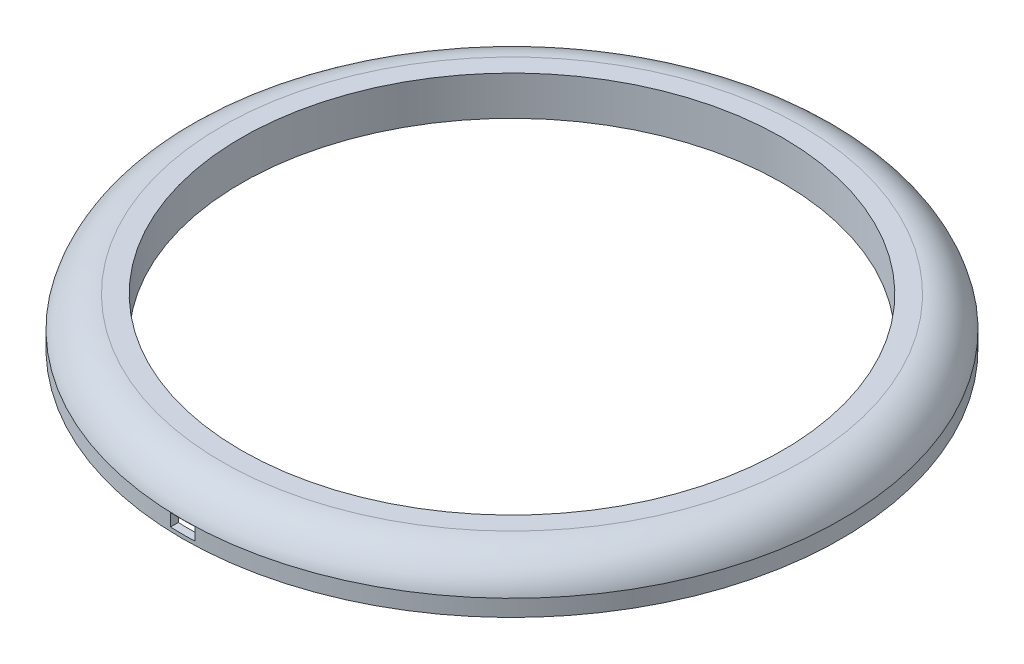
ISO-10303-21;
HEADER;
FILE_DESCRIPTION(('STEP AP214'),'2;1');
FILE_NAME('part.step','',(''),(''),'','','');
FILE_SCHEMA(('AUTOMOTIVE_DESIGN { 1 0 10303 214 1 1 1 1 }'));
ENDSEC;
DATA;
#1=APPLICATION_CONTEXT('core data for automotive mechanical design processes');
#2=APPLICATION_PROTOCOL_DEFINITION('international standard','automotive_design',2000,#1);
#3=PRODUCT_CONTEXT('',#1,'mechanical');
#4=PRODUCT('Part','Part','',(#3));
#5=PRODUCT_RELATED_PRODUCT_CATEGORY('part','',(#4));
#6=PRODUCT_DEFINITION_FORMATION('','',#4);
#7=PRODUCT_DEFINITION_CONTEXT('part definition',#1,'design');
#8=PRODUCT_DEFINITION('design','',#6,#7);
#9=PRODUCT_DEFINITION_SHAPE('','',#8);
#10=(LENGTH_UNIT() NAMED_UNIT(*) SI_UNIT(.MILLI.,.METRE.));
#11=(NAMED_UNIT(*) PLANE_ANGLE_UNIT() SI_UNIT($,.RADIAN.));
#12=(NAMED_UNIT(*) SI_UNIT($,.STERADIAN.) SOLID_ANGLE_UNIT());
#13=UNCERTAINTY_MEASURE_WITH_UNIT(LENGTH_MEASURE(1.E-05),#10,'distance_accuracy_value','');
#14=(GEOMETRIC_REPRESENTATION_CONTEXT(3) GLOBAL_UNCERTAINTY_ASSIGNED_CONTEXT((#13)) GLOBAL_UNIT_ASSIGNED_CONTEXT((#10,
#11,#12)) REPRESENTATION_CONTEXT('',''));
#15=CARTESIAN_POINT('',(0.,0.,0.));
#16=DIRECTION('',(0.,0.,1.));
#17=DIRECTION('',(1.,0.,0.));
#18=AXIS2_PLACEMENT_3D('',#15,#16,#17);
#19=CARTESIAN_POINT('',(0.,0.,-36.));
#20=DIRECTION('',(0.,-1.,0.));
#21=DIRECTION('',(0.,0.,-1.));
#22=AXIS2_PLACEMENT_3D('',#19,#20,#21);
#23=PLANE('',#22);
#24=CARTESIAN_POINT('',(0.,0.,0.));
#25=DIRECTION('',(0.,-1.,0.));
#26=DIRECTION('',(0.,0.,-1.));
#27=AXIS2_PLACEMENT_3D('',#24,#25,#26);
#28=CIRCLE('',#27,36.);
#29=CARTESIAN_POINT('',(0.,0.,-36.));
#30=VERTEX_POINT('',#29);
#31=EDGE_CURVE('E230',#30,#30,#28,.T.);
#32=ORIENTED_EDGE('',*,*,#31,.T.);
#33=EDGE_LOOP('',(#32));
#34=FACE_BOUND('',#33,.T.);
#35=CARTESIAN_POINT('',(0.,0.,0.));
#36=DIRECTION('',(0.,-1.,0.));
#37=DIRECTION('',(0.,0.,-1.));
#38=AXIS2_PLACEMENT_3D('',#35,#36,#37);
#39=CIRCLE('',#38,34.5);
#40=CARTESIAN_POINT('',(0.,0.,-34.5));
#41=VERTEX_POINT('',#40);
#42=EDGE_CURVE('E187',#41,#41,#39,.T.);
#43=ORIENTED_EDGE('',*,*,#42,.F.);
#44=EDGE_LOOP('',(#43));
#45=FACE_BOUND('',#44,.T.);
#46=ADVANCED_FACE('F33',(#34,#45),#23,.T.);
#47=CARTESIAN_POINT('',(0.,0.,0.));
#48=DIRECTION('',(0.,-1.,0.));
#49=DIRECTION('',(0.,0.,-1.));
#50=AXIS2_PLACEMENT_3D('',#47,#48,#49);
#51=CYLINDRICAL_SURFACE('',#50,36.);
#52=CARTESIAN_POINT('',(0.,3.,0.));
#53=DIRECTION('',(0.,-1.,0.));
#54=DIRECTION('',(0.,0.,-1.));
#55=AXIS2_PLACEMENT_3D('',#52,#53,#54);
#56=CIRCLE('',#55,36.);
#57=CARTESIAN_POINT('',(0.,3.,-36.));
#58=VERTEX_POINT('',#57);
#59=EDGE_CURVE('E254',#58,#58,#56,.T.);
#60=ORIENTED_EDGE('',*,*,#59,.T.);
#61=EDGE_LOOP('',(#60));
#62=FACE_BOUND('',#61,.T.);
#63=ORIENTED_EDGE('',*,*,#31,.F.);
#64=EDGE_LOOP('',(#63));
#65=FACE_BOUND('',#64,.T.);
#66=ADVANCED_FACE('F221',(#62,#65),#51,.T.);
#67=CARTESIAN_POINT('',(0.,3.,-36.));
#68=DIRECTION('',(0.,-1.,0.));
#69=DIRECTION('',(0.,0.,-1.));
#70=AXIS2_PLACEMENT_3D('',#67,#68,#69);
#71=PLANE('',#70);
#72=CARTESIAN_POINT('',(0.,3.,0.));
#73=DIRECTION('',(0.,-1.,0.));
#74=DIRECTION('',(0.,0.,-1.));
#75=AXIS2_PLACEMENT_3D('',#72,#73,#74);
#76=CIRCLE('',#75,38.);
#77=CARTESIAN_POINT('',(0.,3.,-38.));
#78=VERTEX_POINT('',#77);
#79=EDGE_CURVE('E251',#78,#78,#76,.T.);
#80=ORIENTED_EDGE('',*,*,#79,.T.);
#81=EDGE_LOOP('',(#80));
#82=FACE_BOUND('',#81,.T.);
#83=ORIENTED_EDGE('',*,*,#59,.F.);
#84=EDGE_LOOP('',(#83));
#85=FACE_BOUND('',#84,.T.);
#86=ADVANCED_FACE('F218',(#82,#85),#71,.T.);
#87=CARTESIAN_POINT('',(0.,-0.190380762242422,0.));
#88=DIRECTION('',(0.,-1.,0.));
#89=DIRECTION('',(0.,0.,-1.));
#90=AXIS2_PLACEMENT_3D('',#87,#88,#89);
#91=TOROIDAL_SURFACE('',#90,38.039746158505,3.19062833391833);
#92=CARTESIAN_POINT('',(1.55,1.23252734273182,40.8661353646626));
#93=CARTESIAN_POINT('',(1.55,1.07223007975292,40.9460531045069));
#94=CARTESIAN_POINT('',(1.55,0.905069161436904,41.012495502063));
#95=CARTESIAN_POINT('',(1.55,0.561825495358684,41.1164252413259));
#96=CARTESIAN_POINT('',(1.55,0.385732300104668,41.1538778027628));
#97=CARTESIAN_POINT('',(1.55,0.0298231714768731,41.1986639732572));
#98=CARTESIAN_POINT('',(1.55,-0.149990986807679,41.2060116255078));
#99=CARTESIAN_POINT('',(1.55,-0.508250749210575,41.1904065612057));
#100=CARTESIAN_POINT('',(1.55,-0.686696680860758,41.1674613395054));
#101=CARTESIAN_POINT('',(1.55,-1.03720348854438,41.0919411994032));
#102=CARTESIAN_POINT('',(1.55,-1.20926442845588,41.0393665775112));
#103=CARTESIAN_POINT('',(1.55,-1.54212722674712,40.9060818012007));
#104=CARTESIAN_POINT('',(1.55,-1.70292863952086,40.8253705340039));
#105=CARTESIAN_POINT('',(1.55,-2.00874345761744,40.6380881901317));
#106=CARTESIAN_POINT('',(1.55,-2.15375317419485,40.5315110902072));
#107=CARTESIAN_POINT('',(1.55,-2.42383472342938,40.2955380991907));
#108=CARTESIAN_POINT('',(1.55,-2.54890654051644,40.166142190279));
#109=CARTESIAN_POINT('',(1.55,-2.77564382849676,39.8881232512213));
#110=CARTESIAN_POINT('',(1.55,-2.87729525734942,39.7394887692707));
#111=CARTESIAN_POINT('',(1.55,-3.05422289962719,39.4272739157966));
#112=CARTESIAN_POINT('',(1.55,-3.12949905546619,39.2636935116422));
#113=CARTESIAN_POINT('',(1.55,-3.25159738083563,38.9261013840367));
#114=CARTESIAN_POINT('',(1.55,-3.29839860760905,38.7520820860708));
#115=CARTESIAN_POINT('',(1.55,-3.36214057777975,38.3986577374815));
#116=CARTESIAN_POINT('',(1.55,-3.37908117780869,38.2192526610038));
#117=CARTESIAN_POINT('',(1.55,-3.38262671655754,37.8600373542457));
#118=CARTESIAN_POINT('',(1.55,-3.36921384477464,37.6802269479727));
#119=CARTESIAN_POINT('',(1.55,-3.31239646938842,37.325408494133));
#120=CARTESIAN_POINT('',(1.55,-3.26899192266227,37.1504004534718));
#121=CARTESIAN_POINT('',(1.55,-3.1534091866672,36.8101260723854));
#122=CARTESIAN_POINT('',(1.55,-3.08122622740947,36.6448613521196));
#123=CARTESIAN_POINT('',(1.55,-2.91012886253667,36.3288023892174));
#124=CARTESIAN_POINT('',(1.55,-2.81121448743327,36.1780081300646));
#125=CARTESIAN_POINT('',(1.55,-2.58949900658368,35.8952377268581));
#126=CARTESIAN_POINT('',(1.55,-2.46670727718215,35.7632542311895));
#127=CARTESIAN_POINT('',(1.55,-2.20069214386888,35.521796452422));
#128=CARTESIAN_POINT('',(1.55,-2.05746882734619,35.4123220730531));
#129=CARTESIAN_POINT('',(1.55,-1.7547824232324,35.2190887196674));
#130=CARTESIAN_POINT('',(1.55,-1.5953329188581,35.1353084686958));
#131=CARTESIAN_POINT('',(1.55,-1.26462256754677,34.9957338137089));
#132=CARTESIAN_POINT('',(1.55,-1.09336178257452,34.9399392628866));
#133=CARTESIAN_POINT('',(1.55,-0.744053883564811,34.8579685785178));
#134=CARTESIAN_POINT('',(1.55,-0.566012934305578,34.8317661733613));
#135=CARTESIAN_POINT('',(1.55,-0.208059691377816,34.8096397817821));
#136=CARTESIAN_POINT('',(1.55,-0.0281474045626309,34.8137156845109));
#137=CARTESIAN_POINT('',(1.55,0.328350175563253,34.852019830918));
#138=CARTESIAN_POINT('',(1.55,0.504937025983175,34.8862335851969));
#139=CARTESIAN_POINT('',(1.55,0.849862067206839,34.9838163578936));
#140=CARTESIAN_POINT('',(1.55,1.01820025322403,35.0471853932294));
#141=CARTESIAN_POINT('',(1.55,1.34188808830025,35.2012863395525));
#142=CARTESIAN_POINT('',(1.55,1.49723518199995,35.2920236178031));
#143=CARTESIAN_POINT('',(1.55,1.7905060704385,35.4982719722684));
#144=CARTESIAN_POINT('',(1.55,1.92842981969696,35.6137831131487));
#145=CARTESIAN_POINT('',(1.55,2.18305306705345,35.8663921608936));
#146=CARTESIAN_POINT('',(1.55,2.29973634409785,36.0035064179275));
#147=CARTESIAN_POINT('',(1.55,2.50845270589406,36.2953633214862));
#148=CARTESIAN_POINT('',(1.55,2.60048562121129,36.4501060891703));
#149=CARTESIAN_POINT('',(1.55,2.75737525515706,36.7729789981239));
#150=CARTESIAN_POINT('',(1.55,2.82220713346841,36.9411212099444));
#151=CARTESIAN_POINT('',(1.55,2.92274198621034,37.2858998924999));
#152=CARTESIAN_POINT('',(1.55,2.95844478811656,37.4625364135382));
#153=CARTESIAN_POINT('',(1.55,2.99972517887538,37.8194095134013));
#154=CARTESIAN_POINT('',(1.55,3.00528359316994,37.999648310468));
#155=CARTESIAN_POINT('',(1.55,2.98606434571708,38.3584945914405));
#156=CARTESIAN_POINT('',(1.55,2.96128783667612,38.5371021370729));
#157=CARTESIAN_POINT('',(1.55,2.88210115421626,38.887616992924));
#158=CARTESIAN_POINT('',(1.55,2.82769176992877,39.0595244814363));
#159=CARTESIAN_POINT('',(1.55,2.69075431310831,39.3918046491277));
#160=CARTESIAN_POINT('',(1.55,2.6082193044635,39.5521744711553));
#161=CARTESIAN_POINT('',(1.55,2.41738567369635,39.8567631640491));
#162=CARTESIAN_POINT('',(1.55,2.30908580436502,40.0009812525554));
#163=CARTESIAN_POINT('',(1.55,2.06986700932004,40.2690324463341));
#164=CARTESIAN_POINT('',(1.55,1.93897553734607,40.3928899415903));
#165=CARTESIAN_POINT('',(1.55,1.71103581323013,40.5747826709916));
#166=CARTESIAN_POINT('',(1.55,1.61968857680391,40.6400898453021));
#167=CARTESIAN_POINT('',(1.55,1.43063419917062,40.760738569185));
#168=CARTESIAN_POINT('',(1.55,1.33292705975759,40.8160801215686));
#169=CARTESIAN_POINT('',(1.55,1.23252734273182,40.8661353646626));
#170=B_SPLINE_CURVE_WITH_KNOTS('',3,(#92,#93,#94,#95,#96,#97,#98,#99,#100,#101,#102,#103,#104,
#105,#106,#107,#108,#109,#110,#111,#112,#113,#114,#115,#116,#117,#118,#119,#120,#121,#122,#123,
#124,#125,#126,#127,#128,#129,#130,#131,#132,#133,#134,#135,#136,#137,#138,#139,#140,#141,#142,
#143,#144,#145,#146,#147,#148,#149,#150,#151,#152,#153,#154,#155,#156,#157,#158,#159,#160,#161,
#162,#163,#164,#165,#166,#167,#168,#169),.UNSPECIFIED.,.T.,.F.,(4,2,2,2,2,2,2,2,2,2,2,2,2,2,2,2,
2,2,2,2,2,2,2,2,2,2,2,2,2,2,2,2,2,2,2,2,2,2,4),(0.,0.536934634114277,1.07451245606949,
1.61183948274425,2.14903359261011,2.68622232671699,3.22343230855328,3.76076750806384,
4.29810312719262,4.83576008030736,5.37341820730103,5.91147129488442,6.44952696578823,
6.98789843340526,7.52627067510865,8.06473218851523,8.60319308731601,9.14144296456935,
9.67969053971433,10.2174911883965,10.755289015863,11.2926090155673,11.8299270481531,
12.3669868948181,12.904047053125,13.441212604369,13.9783795577547,14.5159550326488,
15.0535342024802,15.5916032331908,16.1296754507289,16.668089890774,17.2064838720715,
17.7448635164939,18.2833760279081,18.8219146125993,19.3598033045037,19.6961041216935,
20.0324048440178),.UNSPECIFIED.);
#171=CARTESIAN_POINT('',(1.55,1.1,40.9284585400958));
#172=VERTEX_POINT('',#171);
#173=CARTESIAN_POINT('',(1.55,0.999999999999999,40.9706907435059));
#174=VERTEX_POINT('',#173);
#175=EDGE_CURVE('E120',#172,#174,#170,.T.);
#176=ORIENTED_EDGE('',*,*,#175,.F.);
#177=CARTESIAN_POINT('',(0.,1.1,0.));
#178=DIRECTION('',(0.,1.,0.));
#179=DIRECTION('',(0.,0.,1.));
#180=AXIS2_PLACEMENT_3D('',#177,#178,#179);
#181=CIRCLE('',#180,40.9577980178175);
#182=CARTESIAN_POINT('',(-1.55,1.1,40.9284585400958));
#183=VERTEX_POINT('',#182);
#184=EDGE_CURVE('E108',#183,#172,#181,.T.);
#185=ORIENTED_EDGE('',*,*,#184,.F.);
#186=CARTESIAN_POINT('',(-1.55,1.23252734273182,40.8661353646626));
#187=CARTESIAN_POINT('',(-1.55,1.39294306415896,40.7861407719262));
#188=CARTESIAN_POINT('',(-1.55,1.54671711815699,40.6925335672317));
#189=CARTESIAN_POINT('',(-1.55,1.83648873123027,40.4807449553759));
#190=CARTESIAN_POINT('',(-1.55,1.97246453758413,40.3625339263026));
#191=CARTESIAN_POINT('',(-1.55,2.22258198405492,40.1050099707814));
#192=CARTESIAN_POINT('',(-1.55,2.33673467302663,39.965707786963));
#193=CARTESIAN_POINT('',(-1.55,2.54001461572931,39.6699624082513));
#194=CARTESIAN_POINT('',(-1.55,2.62914806674035,39.5135234715132));
#195=CARTESIAN_POINT('',(-1.55,2.77996479555138,39.1878088708771));
#196=CARTESIAN_POINT('',(-1.55,2.84163063335803,39.0185251310293));
#197=CARTESIAN_POINT('',(-1.55,2.93568975053719,38.6720048181914));
#198=CARTESIAN_POINT('',(-1.55,2.96808176445372,38.4947679017472));
#199=CARTESIAN_POINT('',(-1.55,3.00268825829008,38.1372580737816));
#200=CARTESIAN_POINT('',(-1.55,3.00488356039206,37.9569833056815));
#201=CARTESIAN_POINT('',(-1.55,2.97898721318641,37.598622522107));
#202=CARTESIAN_POINT('',(-1.55,2.95089554846374,37.4205365077465));
#203=CARTESIAN_POINT('',(-1.55,2.86520754044586,37.0715535544173));
#204=CARTESIAN_POINT('',(-1.55,2.80760244204927,36.9006587649991));
#205=CARTESIAN_POINT('',(-1.55,2.6645123889255,36.5709693784923));
#206=CARTESIAN_POINT('',(-1.55,2.57902749668991,36.4121747542826));
#207=CARTESIAN_POINT('',(-1.55,2.38262175783065,36.1112389337442));
#208=CARTESIAN_POINT('',(-1.55,2.27170722556116,35.9690936164945));
#209=CARTESIAN_POINT('',(-1.55,2.02757188826825,35.7054586286559));
#210=CARTESIAN_POINT('',(-1.55,1.89435113951735,35.58396890596));
#211=CARTESIAN_POINT('',(-1.55,1.60948953521088,35.3651932619304));
#212=CARTESIAN_POINT('',(-1.55,1.45786248478039,35.2678893656085));
#213=CARTESIAN_POINT('',(-1.55,1.14041289254535,35.1001460422765));
#214=CARTESIAN_POINT('',(-1.55,0.974590431464048,35.0297064625128));
#215=CARTESIAN_POINT('',(-1.55,0.63362082238187,34.9177577610875));
#216=CARTESIAN_POINT('',(-1.55,0.458482386096092,34.8762221050042));
#217=CARTESIAN_POINT('',(-1.55,0.103716946254007,34.8231640865431));
#218=CARTESIAN_POINT('',(-1.55,-0.0759100388763773,34.8116416009788));
#219=CARTESIAN_POINT('',(-1.55,-0.43443421409284,34.8189370088715));
#220=CARTESIAN_POINT('',(-1.55,-0.613331789436158,34.8377359859585));
#221=CARTESIAN_POINT('',(-1.55,-0.965431292074104,34.9051013761559));
#222=CARTESIAN_POINT('',(-1.55,-1.13863322447085,34.9536677626001));
#223=CARTESIAN_POINT('',(-1.55,-1.47443105102355,35.079182475939));
#224=CARTESIAN_POINT('',(-1.55,-1.63702676711481,35.1561312791938));
#225=CARTESIAN_POINT('',(-1.55,-1.94700321835975,35.3362172334492));
#226=CARTESIAN_POINT('',(-1.55,-2.09438390849041,35.4393544619413));
#227=CARTESIAN_POINT('',(-1.55,-2.36985132767691,35.6689575839849));
#228=CARTESIAN_POINT('',(-1.55,-2.49792551189721,35.7954385279463));
#229=CARTESIAN_POINT('',(-1.55,-2.73104563762417,36.0680895688088));
#230=CARTESIAN_POINT('',(-1.55,-2.83609146792585,36.2142597607846));
#231=CARTESIAN_POINT('',(-1.55,-3.02027478132757,36.5222845031627));
#232=CARTESIAN_POINT('',(-1.55,-3.09938832945488,36.6841533655881));
#233=CARTESIAN_POINT('',(-1.55,-3.22933986753424,37.0188690530258));
#234=CARTESIAN_POINT('',(-1.55,-3.28017772065572,37.1917159311578));
#235=CARTESIAN_POINT('',(-1.55,-3.35216822828836,37.5436163829808));
#236=CARTESIAN_POINT('',(-1.55,-3.3732992486519,37.7226743828155));
#237=CARTESIAN_POINT('',(-1.55,-3.38520767763612,38.0817969546054));
#238=CARTESIAN_POINT('',(-1.55,-3.37598505856211,38.2618615274787));
#239=CARTESIAN_POINT('',(-1.55,-3.32743900076571,38.6179277759995));
#240=CARTESIAN_POINT('',(-1.55,-3.28810883043759,38.7939285339707));
#241=CARTESIAN_POINT('',(-1.55,-3.18044943742268,39.1368259035385));
#242=CARTESIAN_POINT('',(-1.55,-3.11212019143163,39.3037225078188));
#243=CARTESIAN_POINT('',(-1.55,-2.94842125185689,39.6236146699188));
#244=CARTESIAN_POINT('',(-1.55,-2.85306013625459,39.776614617239));
#245=CARTESIAN_POINT('',(-1.55,-2.63798866389093,40.064419551469));
#246=CARTESIAN_POINT('',(-1.55,-2.51827833688591,40.1992245606139));
#247=CARTESIAN_POINT('',(-1.55,-2.25798846030533,40.4467184948547));
#248=CARTESIAN_POINT('',(-1.55,-2.11742240722211,40.5594216141739));
#249=CARTESIAN_POINT('',(-1.55,-1.81935802012191,40.759604293886));
#250=CARTESIAN_POINT('',(-1.55,-1.66186041883394,40.8470849452027));
#251=CARTESIAN_POINT('',(-1.55,-1.33454006972784,40.9942730402336));
#252=CARTESIAN_POINT('',(-1.55,-1.16472760077113,41.0540033448078));
#253=CARTESIAN_POINT('',(-1.55,-0.817435013904652,41.144103774228));
#254=CARTESIAN_POINT('',(-1.55,-0.639953022285167,41.1744666815956));
#255=CARTESIAN_POINT('',(-1.55,-0.282433275631299,41.2049478468946));
#256=CARTESIAN_POINT('',(-1.55,-0.102395599392295,41.2050670352661));
#257=CARTESIAN_POINT('',(-1.55,0.254988849888178,41.1750470601776));
#258=CARTESIAN_POINT('',(-1.55,0.432338606495075,41.1449443906567));
#259=CARTESIAN_POINT('',(-1.55,0.713990922099459,41.0723288601239));
#260=CARTESIAN_POINT('',(-1.55,0.820677685420627,41.0387429882407));
#261=CARTESIAN_POINT('',(-1.55,1.02994574196748,40.960579842086));
#262=CARTESIAN_POINT('',(-1.55,1.13252703618613,40.916002570473));
#263=CARTESIAN_POINT('',(-1.55,1.23252734273182,40.8661353646626));
#264=B_SPLINE_CURVE_WITH_KNOTS('',3,(#186,#187,#188,#189,#190,#191,#192,#193,#194,#195,#196,
#197,#198,#199,#200,#201,#202,#203,#204,#205,#206,#207,#208,#209,#210,#211,#212,#213,#214,#215,
#216,#217,#218,#219,#220,#221,#222,#223,#224,#225,#226,#227,#228,#229,#230,#231,#232,#233,#234,
#235,#236,#237,#238,#239,#240,#241,#242,#243,#244,#245,#246,#247,#248,#249,#250,#251,#252,#253,
#254,#255,#256,#257,#258,#259,#260,#261,#262,#263),.UNSPECIFIED.,.T.,.F.,(4,2,2,2,2,2,2,2,2,2,2,
2,2,2,2,2,2,2,2,2,2,2,2,2,2,2,2,2,2,2,2,2,2,2,2,2,2,2,4),(0.,0.537356636441003,1.07536400801293,
1.61309826553844,2.1506992081917,2.68864100458373,3.226606054142,3.76491274751178,
4.30321971486148,4.84168646244163,5.38015200307573,5.9184839835479,6.45681460597532,
6.99474393486366,7.53267020498043,8.07010199345353,8.6075315760799,9.14462600715656,
9.68171995709449,10.2188229218273,10.7559274758641,11.2933795351094,11.8308341896782,
12.3687835163137,12.906735446149,13.4450789395473,13.9834229241309,14.5218873096816,
15.0603521279542,15.5986462669323,16.1369397480834,16.6748863873422,17.2128097558077,
17.7502891913675,18.2879006870209,18.825495643196,19.362442214722,19.6974208619973,
20.0323994282525),.UNSPECIFIED.);
#265=CARTESIAN_POINT('',(-1.55,0.999999999999999,40.9706907435059));
#266=VERTEX_POINT('',#265);
#267=EDGE_CURVE('E277',#266,#183,#264,.T.);
#268=ORIENTED_EDGE('',*,*,#267,.F.);
#269=CARTESIAN_POINT('',(0.,0.999999999999999,0.));
#270=DIRECTION('',(0.,-1.,0.));
#271=DIRECTION('',(0.,0.,-1.));
#272=AXIS2_PLACEMENT_3D('',#269,#270,#271);
#273=CIRCLE('',#272,41.);
#274=CARTESIAN_POINT('',(-1.55,0.999999999999999,-40.9706907435059));
#275=VERTEX_POINT('',#274);
#276=EDGE_CURVE('E249',#266,#275,#273,.T.);
#277=ORIENTED_EDGE('',*,*,#276,.T.);
#278=CARTESIAN_POINT('',(-1.55,1.23252734273182,-40.8661353646626));
#279=CARTESIAN_POINT('',(-1.55,1.07223007975292,-40.9460531045069));
#280=CARTESIAN_POINT('',(-1.55,0.905069161436904,-41.012495502063));
#281=CARTESIAN_POINT('',(-1.55,0.561825495358684,-41.1164252413259));
#282=CARTESIAN_POINT('',(-1.55,0.385732300104668,-41.1538778027628));
#283=CARTESIAN_POINT('',(-1.55,0.0298231714768731,-41.1986639732572));
#284=CARTESIAN_POINT('',(-1.55,-0.149990986807679,-41.2060116255078));
#285=CARTESIAN_POINT('',(-1.55,-0.508250749210575,-41.1904065612057));
#286=CARTESIAN_POINT('',(-1.55,-0.686696680860758,-41.1674613395054));
#287=CARTESIAN_POINT('',(-1.55,-1.03720348854438,-41.0919411994032));
#288=CARTESIAN_POINT('',(-1.55,-1.20926442845588,-41.0393665775112));
#289=CARTESIAN_POINT('',(-1.55,-1.54212722674712,-40.9060818012007));
#290=CARTESIAN_POINT('',(-1.55,-1.70292863952086,-40.8253705340039));
#291=CARTESIAN_POINT('',(-1.55,-2.00874345761744,-40.6380881901317));
#292=CARTESIAN_POINT('',(-1.55,-2.15375317419485,-40.5315110902072));
#293=CARTESIAN_POINT('',(-1.55,-2.42383472342938,-40.2955380991907));
#294=CARTESIAN_POINT('',(-1.55,-2.54890654051644,-40.166142190279));
#295=CARTESIAN_POINT('',(-1.55,-2.77564382849676,-39.8881232512213));
#296=CARTESIAN_POINT('',(-1.55,-2.87729525734942,-39.7394887692707));
#297=CARTESIAN_POINT('',(-1.55,-3.05422289962719,-39.4272739157966));
#298=CARTESIAN_POINT('',(-1.55,-3.12949905546619,-39.2636935116422));
#299=CARTESIAN_POINT('',(-1.55,-3.25159738083563,-38.9261013840367));
#300=CARTESIAN_POINT('',(-1.55,-3.29839860760905,-38.7520820860708));
#301=CARTESIAN_POINT('',(-1.55,-3.36214057777975,-38.3986577374815));
#302=CARTESIAN_POINT('',(-1.55,-3.37908117780869,-38.2192526610038));
#303=CARTESIAN_POINT('',(-1.55,-3.38262671655754,-37.8600373542457));
#304=CARTESIAN_POINT('',(-1.55,-3.36921384477464,-37.6802269479727));
#305=CARTESIAN_POINT('',(-1.55,-3.31239646938842,-37.325408494133));
#306=CARTESIAN_POINT('',(-1.55,-3.26899192266227,-37.1504004534718));
#307=CARTESIAN_POINT('',(-1.55,-3.1534091866672,-36.8101260723854));
#308=CARTESIAN_POINT('',(-1.55,-3.08122622740947,-36.6448613521196));
#309=CARTESIAN_POINT('',(-1.55,-2.91012886253667,-36.3288023892174));
#310=CARTESIAN_POINT('',(-1.55,-2.81121448743327,-36.1780081300646));
#311=CARTESIAN_POINT('',(-1.55,-2.58949900658368,-35.8952377268581));
#312=CARTESIAN_POINT('',(-1.55,-2.46670727718215,-35.7632542311895));
#313=CARTESIAN_POINT('',(-1.55,-2.20069214386888,-35.521796452422));
#314=CARTESIAN_POINT('',(-1.55,-2.05746882734619,-35.4123220730531));
#315=CARTESIAN_POINT('',(-1.55,-1.7547824232324,-35.2190887196674));
#316=CARTESIAN_POINT('',(-1.55,-1.5953329188581,-35.1353084686958));
#317=CARTESIAN_POINT('',(-1.55,-1.26462256754677,-34.9957338137089));
#318=CARTESIAN_POINT('',(-1.55,-1.09336178257452,-34.9399392628866));
#319=CARTESIAN_POINT('',(-1.55,-0.744053883564811,-34.8579685785178));
#320=CARTESIAN_POINT('',(-1.55,-0.566012934305578,-34.8317661733613));
#321=CARTESIAN_POINT('',(-1.55,-0.208059691377816,-34.8096397817821));
#322=CARTESIAN_POINT('',(-1.55,-0.0281474045626309,-34.8137156845109));
#323=CARTESIAN_POINT('',(-1.55,0.328350175563253,-34.852019830918));
#324=CARTESIAN_POINT('',(-1.55,0.504937025983175,-34.8862335851969));
#325=CARTESIAN_POINT('',(-1.55,0.849862067206839,-34.9838163578936));
#326=CARTESIAN_POINT('',(-1.55,1.01820025322403,-35.0471853932294));
#327=CARTESIAN_POINT('',(-1.55,1.34188808830025,-35.2012863395525));
#328=CARTESIAN_POINT('',(-1.55,1.49723518199995,-35.2920236178031));
#329=CARTESIAN_POINT('',(-1.55,1.7905060704385,-35.4982719722684));
#330=CARTESIAN_POINT('',(-1.55,1.92842981969696,-35.6137831131487));
#331=CARTESIAN_POINT('',(-1.55,2.18305306705345,-35.8663921608936));
#332=CARTESIAN_POINT('',(-1.55,2.29973634409785,-36.0035064179275));
#333=CARTESIAN_POINT('',(-1.55,2.50845270589406,-36.2953633214862));
#334=CARTESIAN_POINT('',(-1.55,2.60048562121129,-36.4501060891703));
#335=CARTESIAN_POINT('',(-1.55,2.75737525515706,-36.7729789981239));
#336=CARTESIAN_POINT('',(-1.55,2.82220713346841,-36.9411212099444));
#337=CARTESIAN_POINT('',(-1.55,2.92274198621034,-37.2858998924999));
#338=CARTESIAN_POINT('',(-1.55,2.95844478811656,-37.4625364135382));
#339=CARTESIAN_POINT('',(-1.55,2.99972517887538,-37.8194095134013));
#340=CARTESIAN_POINT('',(-1.55,3.00528359316994,-37.999648310468));
#341=CARTESIAN_POINT('',(-1.55,2.98606434571708,-38.3584945914405));
#342=CARTESIAN_POINT('',(-1.55,2.96128783667612,-38.5371021370729));
#343=CARTESIAN_POINT('',(-1.55,2.88210115421626,-38.887616992924));
#344=CARTESIAN_POINT('',(-1.55,2.82769176992877,-39.0595244814363));
#345=CARTESIAN_POINT('',(-1.55,2.69075431310831,-39.3918046491277));
#346=CARTESIAN_POINT('',(-1.55,2.6082193044635,-39.5521744711553));
#347=CARTESIAN_POINT('',(-1.55,2.41738567369635,-39.8567631640491));
#348=CARTESIAN_POINT('',(-1.55,2.30908580436502,-40.0009812525554));
#349=CARTESIAN_POINT('',(-1.55,2.06986700932004,-40.2690324463341));
#350=CARTESIAN_POINT('',(-1.55,1.93897553734607,-40.3928899415903));
#351=CARTESIAN_POINT('',(-1.55,1.71103581323013,-40.5747826709916));
#352=CARTESIAN_POINT('',(-1.55,1.61968857680391,-40.6400898453021));
#353=CARTESIAN_POINT('',(-1.55,1.43063419917062,-40.760738569185));
#354=CARTESIAN_POINT('',(-1.55,1.33292705975759,-40.8160801215686));
#355=CARTESIAN_POINT('',(-1.55,1.23252734273182,-40.8661353646626));
#356=B_SPLINE_CURVE_WITH_KNOTS('',3,(#278,#279,#280,#281,#282,#283,#284,#285,#286,#287,#288,
#289,#290,#291,#292,#293,#294,#295,#296,#297,#298,#299,#300,#301,#302,#303,#304,#305,#306,#307,
#308,#309,#310,#311,#312,#313,#314,#315,#316,#317,#318,#319,#320,#321,#322,#323,#324,#325,#326,
#327,#328,#329,#330,#331,#332,#333,#334,#335,#336,#337,#338,#339,#340,#341,#342,#343,#344,#345,
#346,#347,#348,#349,#350,#351,#352,#353,#354,#355),.UNSPECIFIED.,.T.,.F.,(4,2,2,2,2,2,2,2,2,2,2,
2,2,2,2,2,2,2,2,2,2,2,2,2,2,2,2,2,2,2,2,2,2,2,2,2,2,2,4),(0.,0.536934634114277,1.07451245606949,
1.61183948274425,2.14903359261011,2.68622232671699,3.22343230855328,3.76076750806384,
4.29810312719262,4.83576008030736,5.37341820730103,5.91147129488442,6.44952696578823,
6.98789843340526,7.52627067510865,8.06473218851523,8.60319308731601,9.14144296456935,
9.67969053971433,10.2174911883965,10.755289015863,11.2926090155673,11.8299270481531,
12.3669868948181,12.904047053125,13.441212604369,13.9783795577547,14.5159550326488,
15.0535342024802,15.5916032331908,16.1296754507289,16.668089890774,17.2064838720715,
17.7448635164939,18.2833760279081,18.8219146125993,19.3598033045037,19.6961041216935,
20.0324048440178),.UNSPECIFIED.);
#357=CARTESIAN_POINT('',(-1.55,1.1,-40.9284585400958));
#358=VERTEX_POINT('',#357);
#359=EDGE_CURVE('E182',#358,#275,#356,.T.);
#360=ORIENTED_EDGE('',*,*,#359,.F.);
#361=CARTESIAN_POINT('',(0.,1.1,0.));
#362=DIRECTION('',(0.,1.,0.));
#363=DIRECTION('',(0.,0.,1.));
#364=AXIS2_PLACEMENT_3D('',#361,#362,#363);
#365=CIRCLE('',#364,40.9577980178175);
#366=CARTESIAN_POINT('',(1.55,1.1,-40.9284585400958));
#367=VERTEX_POINT('',#366);
#368=EDGE_CURVE('E403',#367,#358,#365,.T.);
#369=ORIENTED_EDGE('',*,*,#368,.F.);
#370=CARTESIAN_POINT('',(1.55,1.23252734273182,-40.8661353646626));
#371=CARTESIAN_POINT('',(1.55,1.39294306415896,-40.7861407719262));
#372=CARTESIAN_POINT('',(1.55,1.54671711815699,-40.6925335672317));
#373=CARTESIAN_POINT('',(1.55,1.83648873123027,-40.4807449553759));
#374=CARTESIAN_POINT('',(1.55,1.97246453758413,-40.3625339263026));
#375=CARTESIAN_POINT('',(1.55,2.22258198405492,-40.1050099707814));
#376=CARTESIAN_POINT('',(1.55,2.33673467302663,-39.965707786963));
#377=CARTESIAN_POINT('',(1.55,2.54001461572931,-39.6699624082513));
#378=CARTESIAN_POINT('',(1.55,2.62914806674035,-39.5135234715132));
#379=CARTESIAN_POINT('',(1.55,2.77996479555138,-39.1878088708771));
#380=CARTESIAN_POINT('',(1.55,2.84163063335803,-39.0185251310293));
#381=CARTESIAN_POINT('',(1.55,2.93568975053719,-38.6720048181914));
#382=CARTESIAN_POINT('',(1.55,2.96808176445372,-38.4947679017472));
#383=CARTESIAN_POINT('',(1.55,3.00268825829008,-38.1372580737816));
#384=CARTESIAN_POINT('',(1.55,3.00488356039206,-37.9569833056815));
#385=CARTESIAN_POINT('',(1.55,2.97898721318641,-37.598622522107));
#386=CARTESIAN_POINT('',(1.55,2.95089554846374,-37.4205365077465));
#387=CARTESIAN_POINT('',(1.55,2.86520754044586,-37.0715535544173));
#388=CARTESIAN_POINT('',(1.55,2.80760244204927,-36.9006587649991));
#389=CARTESIAN_POINT('',(1.55,2.6645123889255,-36.5709693784923));
#390=CARTESIAN_POINT('',(1.55,2.57902749668991,-36.4121747542826));
#391=CARTESIAN_POINT('',(1.55,2.38262175783065,-36.1112389337442));
#392=CARTESIAN_POINT('',(1.55,2.27170722556116,-35.9690936164945));
#393=CARTESIAN_POINT('',(1.55,2.02757188826825,-35.7054586286559));
#394=CARTESIAN_POINT('',(1.55,1.89435113951735,-35.58396890596));
#395=CARTESIAN_POINT('',(1.55,1.60948953521088,-35.3651932619304));
#396=CARTESIAN_POINT('',(1.55,1.45786248478039,-35.2678893656085));
#397=CARTESIAN_POINT('',(1.55,1.14041289254535,-35.1001460422765));
#398=CARTESIAN_POINT('',(1.55,0.974590431464048,-35.0297064625128));
#399=CARTESIAN_POINT('',(1.55,0.63362082238187,-34.9177577610875));
#400=CARTESIAN_POINT('',(1.55,0.458482386096092,-34.8762221050042));
#401=CARTESIAN_POINT('',(1.55,0.103716946254007,-34.8231640865431));
#402=CARTESIAN_POINT('',(1.55,-0.0759100388763773,-34.8116416009788));
#403=CARTESIAN_POINT('',(1.55,-0.43443421409284,-34.8189370088715));
#404=CARTESIAN_POINT('',(1.55,-0.613331789436158,-34.8377359859585));
#405=CARTESIAN_POINT('',(1.55,-0.965431292074104,-34.9051013761559));
#406=CARTESIAN_POINT('',(1.55,-1.13863322447085,-34.9536677626001));
#407=CARTESIAN_POINT('',(1.55,-1.47443105102355,-35.079182475939));
#408=CARTESIAN_POINT('',(1.55,-1.63702676711481,-35.1561312791938));
#409=CARTESIAN_POINT('',(1.55,-1.94700321835975,-35.3362172334492));
#410=CARTESIAN_POINT('',(1.55,-2.09438390849041,-35.4393544619413));
#411=CARTESIAN_POINT('',(1.55,-2.36985132767691,-35.6689575839849));
#412=CARTESIAN_POINT('',(1.55,-2.49792551189721,-35.7954385279463));
#413=CARTESIAN_POINT('',(1.55,-2.73104563762417,-36.0680895688088));
#414=CARTESIAN_POINT('',(1.55,-2.83609146792585,-36.2142597607846));
#415=CARTESIAN_POINT('',(1.55,-3.02027478132757,-36.5222845031627));
#416=CARTESIAN_POINT('',(1.55,-3.09938832945488,-36.6841533655881));
#417=CARTESIAN_POINT('',(1.55,-3.22933986753424,-37.0188690530258));
#418=CARTESIAN_POINT('',(1.55,-3.28017772065572,-37.1917159311578));
#419=CARTESIAN_POINT('',(1.55,-3.35216822828836,-37.5436163829808));
#420=CARTESIAN_POINT('',(1.55,-3.3732992486519,-37.7226743828155));
#421=CARTESIAN_POINT('',(1.55,-3.38520767763612,-38.0817969546054));
#422=CARTESIAN_POINT('',(1.55,-3.37598505856211,-38.2618615274787));
#423=CARTESIAN_POINT('',(1.55,-3.32743900076571,-38.6179277759995));
#424=CARTESIAN_POINT('',(1.55,-3.28810883043759,-38.7939285339707));
#425=CARTESIAN_POINT('',(1.55,-3.18044943742268,-39.1368259035385));
#426=CARTESIAN_POINT('',(1.55,-3.11212019143163,-39.3037225078188));
#427=CARTESIAN_POINT('',(1.55,-2.94842125185689,-39.6236146699188));
#428=CARTESIAN_POINT('',(1.55,-2.85306013625459,-39.776614617239));
#429=CARTESIAN_POINT('',(1.55,-2.63798866389093,-40.064419551469));
#430=CARTESIAN_POINT('',(1.55,-2.51827833688591,-40.1992245606139));
#431=CARTESIAN_POINT('',(1.55,-2.25798846030533,-40.4467184948547));
#432=CARTESIAN_POINT('',(1.55,-2.11742240722211,-40.5594216141739));
#433=CARTESIAN_POINT('',(1.55,-1.81935802012191,-40.759604293886));
#434=CARTESIAN_POINT('',(1.55,-1.66186041883394,-40.8470849452027));
#435=CARTESIAN_POINT('',(1.55,-1.33454006972784,-40.9942730402336));
#436=CARTESIAN_POINT('',(1.55,-1.16472760077113,-41.0540033448078));
#437=CARTESIAN_POINT('',(1.55,-0.817435013904652,-41.144103774228));
#438=CARTESIAN_POINT('',(1.55,-0.639953022285167,-41.1744666815956));
#439=CARTESIAN_POINT('',(1.55,-0.282433275631299,-41.2049478468946));
#440=CARTESIAN_POINT('',(1.55,-0.102395599392295,-41.2050670352661));
#441=CARTESIAN_POINT('',(1.55,0.254988849888178,-41.1750470601776));
#442=CARTESIAN_POINT('',(1.55,0.432338606495075,-41.1449443906567));
#443=CARTESIAN_POINT('',(1.55,0.713990922099459,-41.0723288601239));
#444=CARTESIAN_POINT('',(1.55,0.820677685420627,-41.0387429882407));
#445=CARTESIAN_POINT('',(1.55,1.02994574196748,-40.960579842086));
#446=CARTESIAN_POINT('',(1.55,1.13252703618613,-40.916002570473));
#447=CARTESIAN_POINT('',(1.55,1.23252734273182,-40.8661353646626));
#448=B_SPLINE_CURVE_WITH_KNOTS('',3,(#370,#371,#372,#373,#374,#375,#376,#377,#378,#379,#380,
#381,#382,#383,#384,#385,#386,#387,#388,#389,#390,#391,#392,#393,#394,#395,#396,#397,#398,#399,
#400,#401,#402,#403,#404,#405,#406,#407,#408,#409,#410,#411,#412,#413,#414,#415,#416,#417,#418,
#419,#420,#421,#422,#423,#424,#425,#426,#427,#428,#429,#430,#431,#432,#433,#434,#435,#436,#437,
#438,#439,#440,#441,#442,#443,#444,#445,#446,#447),.UNSPECIFIED.,.T.,.F.,(4,2,2,2,2,2,2,2,2,2,2,
2,2,2,2,2,2,2,2,2,2,2,2,2,2,2,2,2,2,2,2,2,2,2,2,2,2,2,4),(0.,0.537356636441003,1.07536400801293,
1.61309826553844,2.1506992081917,2.68864100458373,3.226606054142,3.76491274751178,
4.30321971486148,4.84168646244163,5.38015200307573,5.9184839835479,6.45681460597532,
6.99474393486366,7.53267020498043,8.07010199345353,8.6075315760799,9.14462600715656,
9.68171995709449,10.2188229218273,10.7559274758641,11.2933795351094,11.8308341896782,
12.3687835163137,12.906735446149,13.4450789395473,13.9834229241309,14.5218873096816,
15.0603521279542,15.5986462669323,16.1369397480834,16.6748863873422,17.2128097558077,
17.7502891913675,18.2879006870209,18.825495643196,19.362442214722,19.6974208619973,
20.0323994282525),.UNSPECIFIED.);
#449=CARTESIAN_POINT('',(1.55,0.999999999999999,-40.9706907435059));
#450=VERTEX_POINT('',#449);
#451=EDGE_CURVE('E170',#450,#367,#448,.T.);
#452=ORIENTED_EDGE('',*,*,#451,.F.);
#453=EDGE_CURVE('E131',#450,#174,#273,.T.);
#454=ORIENTED_EDGE('',*,*,#453,.T.);
#455=EDGE_LOOP('',(#176,#185,#268,#277,#360,#369,#452,#454));
#456=FACE_BOUND('',#455,.T.);
#457=ORIENTED_EDGE('',*,*,#79,.F.);
#458=EDGE_LOOP('',(#457));
#459=FACE_BOUND('',#458,.T.);
#460=ADVANCED_FACE('F127',(#456,#459),#91,.F.);
#461=CARTESIAN_POINT('',(0.,0.,0.));
#462=DIRECTION('',(0.,-1.,0.));
#463=DIRECTION('',(0.,0.,-1.));
#464=AXIS2_PLACEMENT_3D('',#461,#462,#463);
#465=CYLINDRICAL_SURFACE('',#464,41.);
#466=DIRECTION('',(0.,-1.,0.));
#467=VECTOR('',#466,1.);
#468=CARTESIAN_POINT('',(1.55,0.,40.9706907435059));
#469=LINE('',#468,#467);
#470=CARTESIAN_POINT('',(1.55,-0.5,40.9706907435059));
#471=VERTEX_POINT('',#470);
#472=EDGE_CURVE('E133',#174,#471,#469,.T.);
#473=ORIENTED_EDGE('',*,*,#472,.F.);
#474=ORIENTED_EDGE('',*,*,#453,.F.);
#475=DIRECTION('',(0.,-1.,0.));
#476=VECTOR('',#475,1.);
#477=CARTESIAN_POINT('',(1.55,0.,-40.9706907435059));
#478=LINE('',#477,#476);
#479=CARTESIAN_POINT('',(1.55,-0.5,-40.9706907435059));
#480=VERTEX_POINT('',#479);
#481=EDGE_CURVE('E176',#480,#450,#478,.F.);
#482=ORIENTED_EDGE('',*,*,#481,.F.);
#483=CARTESIAN_POINT('',(0.,-0.5,0.));
#484=DIRECTION('',(0.,-1.,0.));
#485=DIRECTION('',(0.,0.,-1.));
#486=AXIS2_PLACEMENT_3D('',#483,#484,#485);
#487=CIRCLE('',#486,41.);
#488=CARTESIAN_POINT('',(-1.55,-0.5,-40.9706907435059));
#489=VERTEX_POINT('',#488);
#490=EDGE_CURVE('E175',#489,#480,#487,.T.);
#491=ORIENTED_EDGE('',*,*,#490,.F.);
#492=DIRECTION('',(0.,-1.,0.));
#493=VECTOR('',#492,1.);
#494=CARTESIAN_POINT('',(-1.55,0.,-40.9706907435059));
#495=LINE('',#494,#493);
#496=EDGE_CURVE('E180',#275,#489,#495,.T.);
#497=ORIENTED_EDGE('',*,*,#496,.F.);
#498=ORIENTED_EDGE('',*,*,#276,.F.);
#499=DIRECTION('',(0.,-1.,0.));
#500=VECTOR('',#499,1.);
#501=CARTESIAN_POINT('',(-1.55,0.,40.9706907435059));
#502=LINE('',#501,#500);
#503=CARTESIAN_POINT('',(-1.55,-0.5,40.9706907435059));
#504=VERTEX_POINT('',#503);
#505=EDGE_CURVE('E115',#504,#266,#502,.F.);
#506=ORIENTED_EDGE('',*,*,#505,.F.);
#507=CARTESIAN_POINT('',(0.,-0.5,0.));
#508=DIRECTION('',(0.,-1.,0.));
#509=DIRECTION('',(0.,0.,-1.));
#510=AXIS2_PLACEMENT_3D('',#507,#508,#509);
#511=CIRCLE('',#510,41.);
#512=EDGE_CURVE('E138',#471,#504,#511,.T.);
#513=ORIENTED_EDGE('',*,*,#512,.F.);
#514=EDGE_LOOP('',(#473,#474,#482,#491,#497,#498,#506,#513));
#515=FACE_BOUND('',#514,.T.);
#516=CARTESIAN_POINT('',(0.,-1.,0.));
#517=DIRECTION('',(0.,-1.,0.));
#518=DIRECTION('',(0.,0.,-1.));
#519=AXIS2_PLACEMENT_3D('',#516,#517,#518);
#520=CIRCLE('',#519,41.);
#521=CARTESIAN_POINT('',(0.,-1.,-41.));
#522=VERTEX_POINT('',#521);
#523=EDGE_CURVE('E246',#522,#522,#520,.T.);
#524=ORIENTED_EDGE('',*,*,#523,.T.);
#525=EDGE_LOOP('',(#524));
#526=FACE_BOUND('',#525,.T.);
#527=ADVANCED_FACE('F211',(#515,#526),#465,.F.);
#528=CARTESIAN_POINT('',(0.,-1.,-41.));
#529=DIRECTION('',(0.,-1.,0.));
#530=DIRECTION('',(0.,0.,-1.));
#531=AXIS2_PLACEMENT_3D('',#528,#529,#530);
#532=PLANE('',#531);
#533=CARTESIAN_POINT('',(0.,-1.,0.));
#534=DIRECTION('',(0.,-1.,0.));
#535=DIRECTION('',(0.,0.,-1.));
#536=AXIS2_PLACEMENT_3D('',#533,#534,#535);
#537=CIRCLE('',#536,42.);
#538=CARTESIAN_POINT('',(0.,-1.,-42.));
#539=VERTEX_POINT('',#538);
#540=EDGE_CURVE('E243',#539,#539,#537,.T.);
#541=ORIENTED_EDGE('',*,*,#540,.T.);
#542=EDGE_LOOP('',(#541));
#543=FACE_BOUND('',#542,.T.);
#544=ORIENTED_EDGE('',*,*,#523,.F.);
#545=EDGE_LOOP('',(#544));
#546=FACE_BOUND('',#545,.T.);
#547=ADVANCED_FACE('F208',(#543,#546),#532,.T.);
#548=CARTESIAN_POINT('',(0.,0.,0.));
#549=DIRECTION('',(0.,-1.,0.));
#550=DIRECTION('',(0.,0.,-1.));
#551=AXIS2_PLACEMENT_3D('',#548,#549,#550);
#552=CYLINDRICAL_SURFACE('',#551,42.);
#553=CARTESIAN_POINT('',(0.,-0.5,0.));
#554=DIRECTION('',(0.,-1.,0.));
#555=DIRECTION('',(0.,0.,-1.));
#556=AXIS2_PLACEMENT_3D('',#553,#554,#555);
#557=CIRCLE('',#556,42.);
#558=CARTESIAN_POINT('',(-1.55,-0.5,41.9713890644568));
#559=VERTEX_POINT('',#558);
#560=CARTESIAN_POINT('',(1.55,-0.5,41.9713890644568));
#561=VERTEX_POINT('',#560);
#562=EDGE_CURVE('E269',#559,#561,#557,.F.);
#563=ORIENTED_EDGE('',*,*,#562,.F.);
#564=DIRECTION('',(0.,-1.,0.));
#565=VECTOR('',#564,1.);
#566=CARTESIAN_POINT('',(-1.55,0.,41.9713890644568));
#567=LINE('',#566,#565);
#568=CARTESIAN_POINT('',(-1.55,1.1,41.9713890644568));
#569=VERTEX_POINT('',#568);
#570=EDGE_CURVE('E11',#569,#559,#567,.T.);
#571=ORIENTED_EDGE('',*,*,#570,.F.);
#572=CARTESIAN_POINT('',(0.,1.1,0.));
#573=DIRECTION('',(0.,1.,0.));
#574=DIRECTION('',(0.,0.,1.));
#575=AXIS2_PLACEMENT_3D('',#572,#573,#574);
#576=CIRCLE('',#575,42.);
#577=CARTESIAN_POINT('',(1.55,1.1,41.9713890644568));
#578=VERTEX_POINT('',#577);
#579=EDGE_CURVE('E267',#578,#569,#576,.F.);
#580=ORIENTED_EDGE('',*,*,#579,.F.);
#581=DIRECTION('',(0.,-1.,0.));
#582=VECTOR('',#581,1.);
#583=CARTESIAN_POINT('',(1.55,0.,41.9713890644568));
#584=LINE('',#583,#582);
#585=EDGE_CURVE('E40',#561,#578,#584,.F.);
#586=ORIENTED_EDGE('',*,*,#585,.F.);
#587=EDGE_LOOP('',(#563,#571,#580,#586));
#588=FACE_BOUND('',#587,.T.);
#589=CARTESIAN_POINT('',(0.,1.1,0.));
#590=DIRECTION('',(0.,1.,0.));
#591=DIRECTION('',(0.,0.,1.));
#592=AXIS2_PLACEMENT_3D('',#589,#590,#591);
#593=CIRCLE('',#592,42.);
#594=CARTESIAN_POINT('',(-1.55,1.1,-41.9713890644568));
#595=VERTEX_POINT('',#594);
#596=CARTESIAN_POINT('',(1.55,1.1,-41.9713890644568));
#597=VERTEX_POINT('',#596);
#598=EDGE_CURVE('E258',#595,#597,#593,.F.);
#599=ORIENTED_EDGE('',*,*,#598,.F.);
#600=DIRECTION('',(0.,-1.,0.));
#601=VECTOR('',#600,1.);
#602=CARTESIAN_POINT('',(-1.55,0.,-41.9713890644568));
#603=LINE('',#602,#601);
#604=CARTESIAN_POINT('',(-1.55,-0.5,-41.9713890644568));
#605=VERTEX_POINT('',#604);
#606=EDGE_CURVE('E264',#605,#595,#603,.F.);
#607=ORIENTED_EDGE('',*,*,#606,.F.);
#608=CARTESIAN_POINT('',(0.,-0.5,0.));
#609=DIRECTION('',(0.,-1.,0.));
#610=DIRECTION('',(0.,0.,-1.));
#611=AXIS2_PLACEMENT_3D('',#608,#609,#610);
#612=CIRCLE('',#611,42.);
#613=CARTESIAN_POINT('',(1.55,-0.5,-41.9713890644568));
#614=VERTEX_POINT('',#613);
#615=EDGE_CURVE('E262',#614,#605,#612,.F.);
#616=ORIENTED_EDGE('',*,*,#615,.F.);
#617=DIRECTION('',(0.,-1.,0.));
#618=VECTOR('',#617,1.);
#619=CARTESIAN_POINT('',(1.55,0.,-41.9713890644568));
#620=LINE('',#619,#618);
#621=EDGE_CURVE('E260',#597,#614,#620,.T.);
#622=ORIENTED_EDGE('',*,*,#621,.F.);
#623=EDGE_LOOP('',(#599,#607,#616,#622));
#624=FACE_BOUND('',#623,.T.);
#625=CARTESIAN_POINT('',(0.,1.11522756803525,0.));
#626=DIRECTION('',(0.,-1.,0.));
#627=DIRECTION('',(0.,0.,-1.));
#628=AXIS2_PLACEMENT_3D('',#625,#626,#627);
#629=CIRCLE('',#628,42.);
#630=CARTESIAN_POINT('',(0.,1.11522756803525,-42.));
#631=VERTEX_POINT('',#630);
#632=EDGE_CURVE('E238',#631,#631,#629,.T.);
#633=ORIENTED_EDGE('',*,*,#632,.T.);
#634=EDGE_LOOP('',(#633));
#635=FACE_BOUND('',#634,.T.);
#636=ORIENTED_EDGE('',*,*,#540,.F.);
#637=EDGE_LOOP('',(#636));
#638=FACE_BOUND('',#637,.T.);
#639=ADVANCED_FACE('F204',(#588,#624,#635,#638),#552,.T.);
#640=CARTESIAN_POINT('',(0.,-0.160077913222418,0.));
#641=DIRECTION('',(0.,-1.,0.));
#642=DIRECTION('',(0.,0.,-1.));
#643=AXIS2_PLACEMENT_3D('',#640,#641,#642);
#644=TOROIDAL_SURFACE('',#643,37.,5.16007791322242);
#645=CARTESIAN_POINT('',(0.,5.,0.));
#646=DIRECTION('',(0.,-1.,0.));
#647=DIRECTION('',(0.,0.,-1.));
#648=AXIS2_PLACEMENT_3D('',#645,#646,#647);
#649=CIRCLE('',#648,37.);
#650=CARTESIAN_POINT('',(0.,5.,-37.));
#651=VERTEX_POINT('',#650);
#652=EDGE_CURVE('E235',#651,#651,#649,.T.);
#653=ORIENTED_EDGE('',*,*,#652,.T.);
#654=EDGE_LOOP('',(#653));
#655=FACE_BOUND('',#654,.T.);
#656=ORIENTED_EDGE('',*,*,#632,.F.);
#657=EDGE_LOOP('',(#656));
#658=FACE_BOUND('',#657,.T.);
#659=ADVANCED_FACE('F200',(#655,#658),#644,.T.);
#660=CARTESIAN_POINT('',(0.,5.,-34.5));
#661=DIRECTION('',(0.,1.,0.));
#662=DIRECTION('',(0.,0.,1.));
#663=AXIS2_PLACEMENT_3D('',#660,#661,#662);
#664=PLANE('',#663);
#665=CARTESIAN_POINT('',(0.,5.,0.));
#666=DIRECTION('',(0.,-1.,0.));
#667=DIRECTION('',(0.,0.,-1.));
#668=AXIS2_PLACEMENT_3D('',#665,#666,#667);
#669=CIRCLE('',#668,34.5);
#670=CARTESIAN_POINT('',(0.,5.,-34.5));
#671=VERTEX_POINT('',#670);
#672=EDGE_CURVE('E233',#671,#671,#669,.T.);
#673=ORIENTED_EDGE('',*,*,#672,.T.);
#674=EDGE_LOOP('',(#673));
#675=FACE_BOUND('',#674,.T.);
#676=ORIENTED_EDGE('',*,*,#652,.F.);
#677=EDGE_LOOP('',(#676));
#678=FACE_BOUND('',#677,.T.);
#679=ADVANCED_FACE('F196',(#675,#678),#664,.T.);
#680=CARTESIAN_POINT('',(0.,0.,0.));
#681=DIRECTION('',(0.,-1.,0.));
#682=DIRECTION('',(0.,0.,-1.));
#683=AXIS2_PLACEMENT_3D('',#680,#681,#682);
#684=CYLINDRICAL_SURFACE('',#683,34.5);
#685=ORIENTED_EDGE('',*,*,#42,.T.);
#686=EDGE_LOOP('',(#685));
#687=FACE_BOUND('',#686,.T.);
#688=ORIENTED_EDGE('',*,*,#672,.F.);
#689=EDGE_LOOP('',(#688));
#690=FACE_BOUND('',#689,.T.);
#691=ADVANCED_FACE('F192',(#687,#690),#684,.F.);
#692=CARTESIAN_POINT('',(-1.55,1.1,-37.));
#693=DIRECTION('',(-1.,0.,0.));
#694=DIRECTION('',(0.,0.,1.));
#695=AXIS2_PLACEMENT_3D('',#692,#693,#694);
#696=PLANE('',#695);
#697=ORIENTED_EDGE('',*,*,#359,.T.);
#698=ORIENTED_EDGE('',*,*,#496,.T.);
#699=DIRECTION('',(0.,0.,-1.));
#700=VECTOR('',#699,1.);
#701=CARTESIAN_POINT('',(-1.55,-0.5,-37.));
#702=LINE('',#701,#700);
#703=EDGE_CURVE('E146',#489,#605,#702,.T.);
#704=ORIENTED_EDGE('',*,*,#703,.T.);
#705=ORIENTED_EDGE('',*,*,#606,.T.);
#706=DIRECTION('',(0.,0.,-1.));
#707=VECTOR('',#706,1.);
#708=CARTESIAN_POINT('',(-1.55,1.1,-37.));
#709=LINE('',#708,#707);
#710=EDGE_CURVE('E132',#358,#595,#709,.T.);
#711=ORIENTED_EDGE('',*,*,#710,.F.);
#712=EDGE_LOOP('',(#697,#698,#704,#705,#711));
#713=FACE_BOUND('',#712,.T.);
#714=ADVANCED_FACE('F162',(#713),#696,.F.);
#715=CARTESIAN_POINT('',(1.55,-0.5,-37.));
#716=DIRECTION('',(0.,-1.,0.));
#717=DIRECTION('',(0.,0.,-1.));
#718=AXIS2_PLACEMENT_3D('',#715,#716,#717);
#719=PLANE('',#718);
#720=ORIENTED_EDGE('',*,*,#490,.T.);
#721=DIRECTION('',(0.,0.,-1.));
#722=VECTOR('',#721,1.);
#723=CARTESIAN_POINT('',(1.55,-0.5,-37.));
#724=LINE('',#723,#722);
#725=EDGE_CURVE('E417',#480,#614,#724,.T.);
#726=ORIENTED_EDGE('',*,*,#725,.T.);
#727=ORIENTED_EDGE('',*,*,#615,.T.);
#728=ORIENTED_EDGE('',*,*,#703,.F.);
#729=EDGE_LOOP('',(#720,#726,#727,#728));
#730=FACE_BOUND('',#729,.T.);
#731=ADVANCED_FACE('F158',(#730),#719,.F.);
#732=CARTESIAN_POINT('',(1.55,1.1,-37.));
#733=DIRECTION('',(1.,0.,0.));
#734=DIRECTION('',(0.,1.,0.));
#735=AXIS2_PLACEMENT_3D('',#732,#733,#734);
#736=PLANE('',#735);
#737=ORIENTED_EDGE('',*,*,#451,.T.);
#738=DIRECTION('',(0.,0.,-1.));
#739=VECTOR('',#738,1.);
#740=CARTESIAN_POINT('',(1.55,1.1,-37.));
#741=LINE('',#740,#739);
#742=EDGE_CURVE('E136',#367,#597,#741,.T.);
#743=ORIENTED_EDGE('',*,*,#742,.T.);
#744=ORIENTED_EDGE('',*,*,#621,.T.);
#745=ORIENTED_EDGE('',*,*,#725,.F.);
#746=ORIENTED_EDGE('',*,*,#481,.T.);
#747=EDGE_LOOP('',(#737,#743,#744,#745,#746));
#748=FACE_BOUND('',#747,.T.);
#749=ADVANCED_FACE('F161',(#748),#736,.F.);
#750=CARTESIAN_POINT('',(1.55,1.1,-37.));
#751=DIRECTION('',(0.,1.,0.));
#752=DIRECTION('',(0.,0.,1.));
#753=AXIS2_PLACEMENT_3D('',#750,#751,#752);
#754=PLANE('',#753);
#755=ORIENTED_EDGE('',*,*,#368,.T.);
#756=ORIENTED_EDGE('',*,*,#710,.T.);
#757=ORIENTED_EDGE('',*,*,#598,.T.);
#758=ORIENTED_EDGE('',*,*,#742,.F.);
#759=EDGE_LOOP('',(#755,#756,#757,#758));
#760=FACE_BOUND('',#759,.T.);
#761=ADVANCED_FACE('F156',(#760),#754,.F.);
#762=CARTESIAN_POINT('',(1.55,1.1,37.));
#763=DIRECTION('',(1.,0.,0.));
#764=DIRECTION('',(0.,0.,-1.));
#765=AXIS2_PLACEMENT_3D('',#762,#763,#764);
#766=PLANE('',#765);
#767=ORIENTED_EDGE('',*,*,#175,.T.);
#768=ORIENTED_EDGE('',*,*,#472,.T.);
#769=DIRECTION('',(0.,0.,1.));
#770=VECTOR('',#769,1.);
#771=CARTESIAN_POINT('',(1.55,-0.5,37.));
#772=LINE('',#771,#770);
#773=EDGE_CURVE('E116',#471,#561,#772,.T.);
#774=ORIENTED_EDGE('',*,*,#773,.T.);
#775=ORIENTED_EDGE('',*,*,#585,.T.);
#776=DIRECTION('',(0.,0.,1.));
#777=VECTOR('',#776,1.);
#778=CARTESIAN_POINT('',(1.55,1.1,37.));
#779=LINE('',#778,#777);
#780=EDGE_CURVE('E54',#172,#578,#779,.T.);
#781=ORIENTED_EDGE('',*,*,#780,.F.);
#782=EDGE_LOOP('',(#767,#768,#774,#775,#781));
#783=FACE_BOUND('',#782,.T.);
#784=ADVANCED_FACE('F119',(#783),#766,.F.);
#785=CARTESIAN_POINT('',(-1.55,-0.5,37.));
#786=DIRECTION('',(0.,-1.,0.));
#787=DIRECTION('',(0.,0.,-1.));
#788=AXIS2_PLACEMENT_3D('',#785,#786,#787);
#789=PLANE('',#788);
#790=ORIENTED_EDGE('',*,*,#512,.T.);
#791=DIRECTION('',(0.,0.,1.));
#792=VECTOR('',#791,1.);
#793=CARTESIAN_POINT('',(-1.55,-0.5,37.));
#794=LINE('',#793,#792);
#795=EDGE_CURVE('E46',#504,#559,#794,.T.);
#796=ORIENTED_EDGE('',*,*,#795,.T.);
#797=ORIENTED_EDGE('',*,*,#562,.T.);
#798=ORIENTED_EDGE('',*,*,#773,.F.);
#799=EDGE_LOOP('',(#790,#796,#797,#798));
#800=FACE_BOUND('',#799,.T.);
#801=ADVANCED_FACE('F155',(#800),#789,.F.);
#802=CARTESIAN_POINT('',(-1.55,1.1,37.));
#803=DIRECTION('',(-1.,0.,0.));
#804=DIRECTION('',(0.,-1.,0.));
#805=AXIS2_PLACEMENT_3D('',#802,#803,#804);
#806=PLANE('',#805);
#807=ORIENTED_EDGE('',*,*,#267,.T.);
#808=DIRECTION('',(0.,0.,1.));
#809=VECTOR('',#808,1.);
#810=CARTESIAN_POINT('',(-1.55,1.1,37.));
#811=LINE('',#810,#809);
#812=EDGE_CURVE('E111',#183,#569,#811,.T.);
#813=ORIENTED_EDGE('',*,*,#812,.T.);
#814=ORIENTED_EDGE('',*,*,#570,.T.);
#815=ORIENTED_EDGE('',*,*,#795,.F.);
#816=ORIENTED_EDGE('',*,*,#505,.T.);
#817=EDGE_LOOP('',(#807,#813,#814,#815,#816));
#818=FACE_BOUND('',#817,.T.);
#819=ADVANCED_FACE('F276',(#818),#806,.F.);
#820=CARTESIAN_POINT('',(-1.55,1.1,37.));
#821=DIRECTION('',(0.,1.,0.));
#822=DIRECTION('',(0.,0.,1.));
#823=AXIS2_PLACEMENT_3D('',#820,#821,#822);
#824=PLANE('',#823);
#825=ORIENTED_EDGE('',*,*,#184,.T.);
#826=ORIENTED_EDGE('',*,*,#780,.T.);
#827=ORIENTED_EDGE('',*,*,#579,.T.);
#828=ORIENTED_EDGE('',*,*,#812,.F.);
#829=EDGE_LOOP('',(#825,#826,#827,#828));
#830=FACE_BOUND('',#829,.T.);
#831=ADVANCED_FACE('F109',(#830),#824,.F.);
#832=CLOSED_SHELL('',(#46,#66,#86,#460,#527,#547,#639,#659,#679,#691,#714,#731,#749,#761,#784,
#801,#819,#831));
#833=MANIFOLD_SOLID_BREP('B2',#832);
#834=ADVANCED_BREP_SHAPE_REPRESENTATION('',(#18,#833),#14);
#835=SHAPE_DEFINITION_REPRESENTATION(#9,#834);
ENDSEC;
END-ISO-10303-21;
